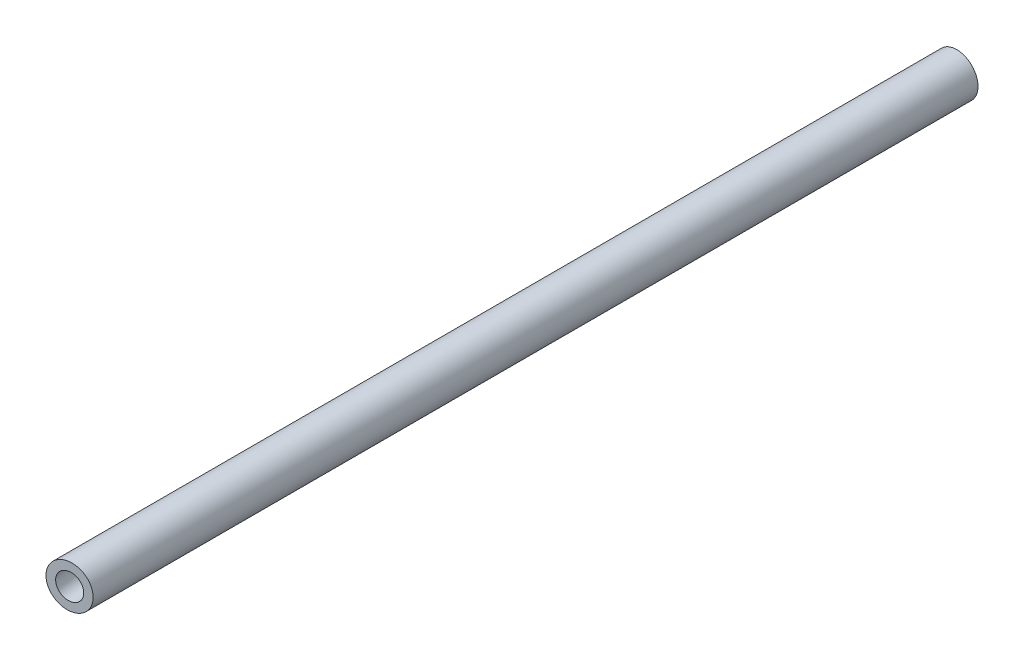
ISO-10303-21;
HEADER;
FILE_DESCRIPTION(('STEP AP214'),'2;1');
FILE_NAME('part.step','',(''),(''),'','','');
FILE_SCHEMA(('AUTOMOTIVE_DESIGN { 1 0 10303 214 1 1 1 1 }'));
ENDSEC;
DATA;
#1=APPLICATION_CONTEXT('core data for automotive mechanical design processes');
#2=APPLICATION_PROTOCOL_DEFINITION('international standard','automotive_design',2000,#1);
#3=PRODUCT_CONTEXT('',#1,'mechanical');
#4=PRODUCT('Part','Part','',(#3));
#5=PRODUCT_RELATED_PRODUCT_CATEGORY('part','',(#4));
#6=PRODUCT_DEFINITION_FORMATION('','',#4);
#7=PRODUCT_DEFINITION_CONTEXT('part definition',#1,'design');
#8=PRODUCT_DEFINITION('design','',#6,#7);
#9=PRODUCT_DEFINITION_SHAPE('','',#8);
#10=(LENGTH_UNIT() NAMED_UNIT(*) SI_UNIT(.MILLI.,.METRE.));
#11=(NAMED_UNIT(*) PLANE_ANGLE_UNIT() SI_UNIT($,.RADIAN.));
#12=(NAMED_UNIT(*) SI_UNIT($,.STERADIAN.) SOLID_ANGLE_UNIT());
#13=UNCERTAINTY_MEASURE_WITH_UNIT(LENGTH_MEASURE(1.E-05),#10,'distance_accuracy_value','');
#14=(GEOMETRIC_REPRESENTATION_CONTEXT(3) GLOBAL_UNCERTAINTY_ASSIGNED_CONTEXT((#13)) GLOBAL_UNIT_ASSIGNED_CONTEXT((#10,
#11,#12)) REPRESENTATION_CONTEXT('',''));
#15=CARTESIAN_POINT('',(0.,0.,0.));
#16=DIRECTION('',(0.,0.,1.));
#17=DIRECTION('',(1.,0.,0.));
#18=AXIS2_PLACEMENT_3D('',#15,#16,#17);
#19=CARTESIAN_POINT('',(0.,0.,500.));
#20=DIRECTION('',(0.,0.,-1.));
#21=DIRECTION('',(-1.,0.,0.));
#22=AXIS2_PLACEMENT_3D('',#19,#20,#21);
#23=CYLINDRICAL_SURFACE('',#22,10.);
#24=CARTESIAN_POINT('',(0.,0.,498.948957647343));
#25=DIRECTION('',(0.104528463267653,0.,0.994521895368274));
#26=DIRECTION('',(0.994521895368274,0.,-0.104528463267653));
#27=AXIS2_PLACEMENT_3D('',#24,#25,#26);
#28=ELLIPSE('',#27,10.0550827956352,10.);
#29=CARTESIAN_POINT('',(10.,0.,497.897915294687));
#30=VERTEX_POINT('',#29);
#31=EDGE_CURVE('E38',#30,#30,#28,.T.);
#32=ORIENTED_EDGE('',*,*,#31,.F.);
#33=EDGE_LOOP('',(#32));
#34=FACE_BOUND('',#33,.T.);
#35=CARTESIAN_POINT('',(0.,0.,83.));
#36=DIRECTION('',(0.,0.,-1.));
#37=DIRECTION('',(-1.,0.,0.));
#38=AXIS2_PLACEMENT_3D('',#35,#36,#37);
#39=CIRCLE('',#38,10.);
#40=CARTESIAN_POINT('',(-10.,0.,83.));
#41=VERTEX_POINT('',#40);
#42=EDGE_CURVE('E48',#41,#41,#39,.T.);
#43=ORIENTED_EDGE('',*,*,#42,.F.);
#44=EDGE_LOOP('',(#43));
#45=FACE_BOUND('',#44,.T.);
#46=ADVANCED_FACE('F31',(#34,#45),#23,.T.);
#47=CARTESIAN_POINT('',(-10.,35.,500.));
#48=DIRECTION('',(0.104528463267653,0.,0.994521895368274));
#49=DIRECTION('',(0.994521895368274,0.,-0.104528463267653));
#50=AXIS2_PLACEMENT_3D('',#47,#48,#49);
#51=PLANE('',#50);
#52=CARTESIAN_POINT('',(0.0546309981648979,0.,498.94321569806));
#53=DIRECTION('',(0.104528463267655,0.,0.994521895368273));
#54=DIRECTION('',(0.994521895368273,0.,-0.104528463267655));
#55=AXIS2_PLACEMENT_3D('',#52,#53,#54);
#56=CIRCLE('',#55,6.);
#57=CARTESIAN_POINT('',(6.02176237037454,0.,498.316044918454));
#58=VERTEX_POINT('',#57);
#59=EDGE_CURVE('E45',#58,#58,#56,.T.);
#60=ORIENTED_EDGE('',*,*,#59,.F.);
#61=EDGE_LOOP('',(#60));
#62=FACE_BOUND('',#61,.T.);
#63=ORIENTED_EDGE('',*,*,#31,.T.);
#64=EDGE_LOOP('',(#63));
#65=FACE_BOUND('',#64,.T.);
#66=ADVANCED_FACE('F68',(#62,#65),#51,.T.);
#67=CARTESIAN_POINT('',(-3.60386521620301,0.,464.13494936017));
#68=DIRECTION('',(0.104528463267655,0.,0.994521895368273));
#69=DIRECTION('',(0.994521895368273,0.,-0.104528463267655));
#70=AXIS2_PLACEMENT_3D('',#67,#68,#69);
#71=CYLINDRICAL_SURFACE('',#70,6.);
#72=CARTESIAN_POINT('',(-3.60386521620301,0.,464.13494936017));
#73=DIRECTION('',(0.104528463267655,0.,0.994521895368273));
#74=DIRECTION('',(0.994521895368273,0.,-0.104528463267655));
#75=AXIS2_PLACEMENT_3D('',#72,#73,#74);
#76=CIRCLE('',#75,6.);
#77=CARTESIAN_POINT('',(2.36326615600663,0.,463.507778580564));
#78=VERTEX_POINT('',#77);
#79=EDGE_CURVE('E42',#78,#78,#76,.T.);
#80=ORIENTED_EDGE('',*,*,#79,.F.);
#81=EDGE_LOOP('',(#80));
#82=FACE_BOUND('',#81,.T.);
#83=ORIENTED_EDGE('',*,*,#59,.T.);
#84=EDGE_LOOP('',(#83));
#85=FACE_BOUND('',#84,.T.);
#86=ADVANCED_FACE('F73',(#82,#85),#71,.F.);
#87=CARTESIAN_POINT('',(-3.60386521620301,0.,464.13494936017));
#88=DIRECTION('',(0.104528463267655,0.,0.994521895368273));
#89=DIRECTION('',(0.994521895368273,0.,-0.104528463267655));
#90=AXIS2_PLACEMENT_3D('',#87,#88,#89);
#91=PLANE('',#90);
#92=ORIENTED_EDGE('',*,*,#79,.T.);
#93=EDGE_LOOP('',(#92));
#94=FACE_BOUND('',#93,.T.);
#95=ADVANCED_FACE('F82',(#94),#91,.T.);
#96=CARTESIAN_POINT('',(-9.99999999999999,20.,83.));
#97=DIRECTION('',(0.,0.,-1.));
#98=DIRECTION('',(-1.,0.,0.));
#99=AXIS2_PLACEMENT_3D('',#96,#97,#98);
#100=PLANE('',#99);
#101=CARTESIAN_POINT('',(0.,0.,83.));
#102=DIRECTION('',(0.,0.,-1.));
#103=DIRECTION('',(-1.,0.,0.));
#104=AXIS2_PLACEMENT_3D('',#101,#102,#103);
#105=CIRCLE('',#104,6.);
#106=CARTESIAN_POINT('',(-6.,0.,83.));
#107=VERTEX_POINT('',#106);
#108=EDGE_CURVE('E34',#107,#107,#105,.F.);
#109=ORIENTED_EDGE('',*,*,#108,.T.);
#110=EDGE_LOOP('',(#109));
#111=FACE_BOUND('',#110,.T.);
#112=ORIENTED_EDGE('',*,*,#42,.T.);
#113=EDGE_LOOP('',(#112));
#114=FACE_BOUND('',#113,.T.);
#115=ADVANCED_FACE('F57',(#111,#114),#100,.T.);
#116=CARTESIAN_POINT('',(0.,0.,118.));
#117=DIRECTION('',(0.,0.,-1.));
#118=DIRECTION('',(-1.,0.,0.));
#119=AXIS2_PLACEMENT_3D('',#116,#117,#118);
#120=PLANE('',#119);
#121=CARTESIAN_POINT('',(0.,0.,118.));
#122=DIRECTION('',(0.,0.,-1.));
#123=DIRECTION('',(-1.,0.,0.));
#124=AXIS2_PLACEMENT_3D('',#121,#122,#123);
#125=CIRCLE('',#124,6.);
#126=CARTESIAN_POINT('',(-6.,0.,118.));
#127=VERTEX_POINT('',#126);
#128=EDGE_CURVE('E10',#127,#127,#125,.T.);
#129=ORIENTED_EDGE('',*,*,#128,.T.);
#130=EDGE_LOOP('',(#129));
#131=FACE_BOUND('',#130,.T.);
#132=ADVANCED_FACE('F61',(#131),#120,.T.);
#133=CARTESIAN_POINT('',(0.,0.,118.));
#134=DIRECTION('',(0.,0.,-1.));
#135=DIRECTION('',(-1.,0.,0.));
#136=AXIS2_PLACEMENT_3D('',#133,#134,#135);
#137=CYLINDRICAL_SURFACE('',#136,6.);
#138=ORIENTED_EDGE('',*,*,#128,.F.);
#139=EDGE_LOOP('',(#138));
#140=FACE_BOUND('',#139,.T.);
#141=ORIENTED_EDGE('',*,*,#108,.F.);
#142=EDGE_LOOP('',(#141));
#143=FACE_BOUND('',#142,.T.);
#144=ADVANCED_FACE('F59',(#140,#143),#137,.F.);
#145=CLOSED_SHELL('',(#46,#66,#86,#95,#115,#132,#144));
#146=MANIFOLD_SOLID_BREP('B2',#145);
#147=ADVANCED_BREP_SHAPE_REPRESENTATION('',(#18,#146),#14);
#148=SHAPE_DEFINITION_REPRESENTATION(#9,#147);
ENDSEC;
END-ISO-10303-21;
